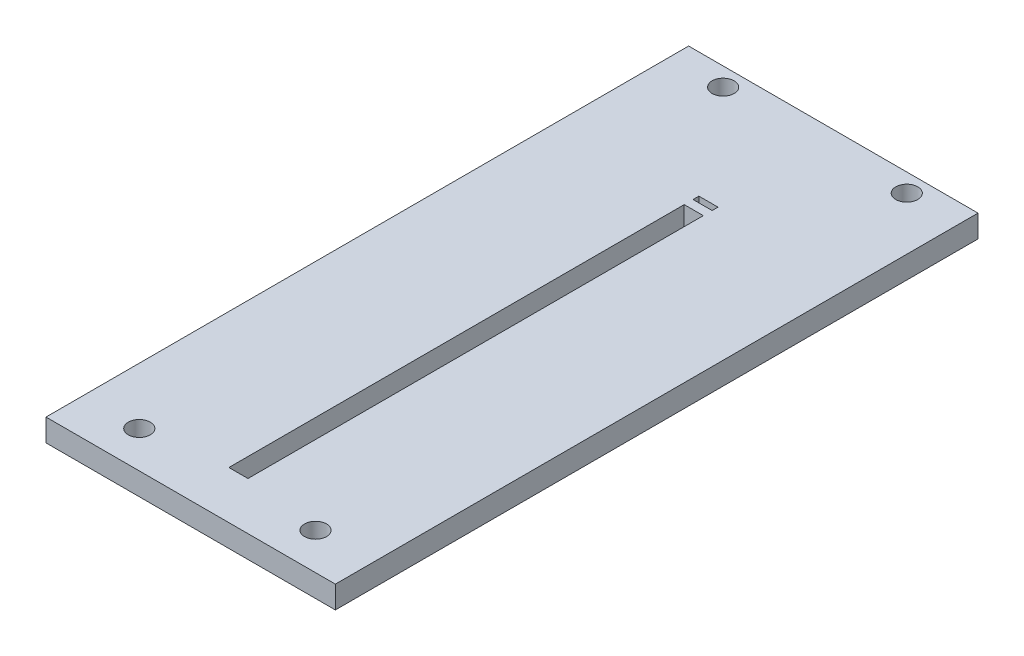
ISO-10303-21;
HEADER;
FILE_DESCRIPTION(('STEP AP214'),'2;1');
FILE_NAME('part.step','',(''),(''),'','','');
FILE_SCHEMA(('AUTOMOTIVE_DESIGN { 1 0 10303 214 1 1 1 1 }'));
ENDSEC;
DATA;
#1=APPLICATION_CONTEXT('core data for automotive mechanical design processes');
#2=APPLICATION_PROTOCOL_DEFINITION('international standard','automotive_design',2000,#1);
#3=PRODUCT_CONTEXT('',#1,'mechanical');
#4=PRODUCT('Part','Part','',(#3));
#5=PRODUCT_RELATED_PRODUCT_CATEGORY('part','',(#4));
#6=PRODUCT_DEFINITION_FORMATION('','',#4);
#7=PRODUCT_DEFINITION_CONTEXT('part definition',#1,'design');
#8=PRODUCT_DEFINITION('design','',#6,#7);
#9=PRODUCT_DEFINITION_SHAPE('','',#8);
#10=(LENGTH_UNIT() NAMED_UNIT(*) SI_UNIT(.MILLI.,.METRE.));
#11=(NAMED_UNIT(*) PLANE_ANGLE_UNIT() SI_UNIT($,.RADIAN.));
#12=(NAMED_UNIT(*) SI_UNIT($,.STERADIAN.) SOLID_ANGLE_UNIT());
#13=UNCERTAINTY_MEASURE_WITH_UNIT(LENGTH_MEASURE(1.E-05),#10,'distance_accuracy_value','');
#14=(GEOMETRIC_REPRESENTATION_CONTEXT(3) GLOBAL_UNCERTAINTY_ASSIGNED_CONTEXT((#13)) GLOBAL_UNIT_ASSIGNED_CONTEXT((#10,
#11,#12)) REPRESENTATION_CONTEXT('',''));
#15=CARTESIAN_POINT('',(0.,0.,0.));
#16=DIRECTION('',(0.,0.,1.));
#17=DIRECTION('',(1.,0.,0.));
#18=AXIS2_PLACEMENT_3D('',#15,#16,#17);
#19=CARTESIAN_POINT('',(0.,3.05,0.));
#20=DIRECTION('',(0.,1.,0.));
#21=DIRECTION('',(0.,0.,1.));
#22=AXIS2_PLACEMENT_3D('',#19,#20,#21);
#23=PLANE('',#22);
#24=CARTESIAN_POINT('',(-12.5,3.05,-85.));
#25=DIRECTION('',(0.,1.,0.));
#26=DIRECTION('',(0.,0.,1.));
#27=AXIS2_PLACEMENT_3D('',#24,#25,#26);
#28=CIRCLE('',#27,1.5);
#29=CARTESIAN_POINT('',(-12.5,3.05,-83.5));
#30=VERTEX_POINT('',#29);
#31=EDGE_CURVE('E530',#30,#30,#28,.T.);
#32=ORIENTED_EDGE('',*,*,#31,.F.);
#33=EDGE_LOOP('',(#32));
#34=FACE_BOUND('',#33,.T.);
#35=CARTESIAN_POINT('',(12.5,3.05,-85.));
#36=DIRECTION('',(0.,1.,0.));
#37=DIRECTION('',(0.,0.,1.));
#38=AXIS2_PLACEMENT_3D('',#35,#36,#37);
#39=CIRCLE('',#38,1.5);
#40=CARTESIAN_POINT('',(12.5,3.05,-83.5));
#41=VERTEX_POINT('',#40);
#42=EDGE_CURVE('E534',#41,#41,#39,.T.);
#43=ORIENTED_EDGE('',*,*,#42,.F.);
#44=EDGE_LOOP('',(#43));
#45=FACE_BOUND('',#44,.T.);
#46=CARTESIAN_POINT('',(12.,3.05,-5.));
#47=DIRECTION('',(0.,-1.,0.));
#48=DIRECTION('',(0.,0.,-1.));
#49=AXIS2_PLACEMENT_3D('',#46,#47,#48);
#50=CIRCLE('',#49,1.5);
#51=CARTESIAN_POINT('',(12.,3.05,-6.5));
#52=VERTEX_POINT('',#51);
#53=EDGE_CURVE('E550',#52,#52,#50,.T.);
#54=ORIENTED_EDGE('',*,*,#53,.T.);
#55=EDGE_LOOP('',(#54));
#56=FACE_BOUND('',#55,.T.);
#57=DIRECTION('',(1.,0.,0.));
#58=VECTOR('',#57,1.);
#59=CARTESIAN_POINT('',(0.,3.05,-6.5));
#60=LINE('',#59,#58);
#61=CARTESIAN_POINT('',(-1.30000000000001,3.05,-6.5));
#62=VERTEX_POINT('',#61);
#63=CARTESIAN_POINT('',(1.30000000000001,3.05,-6.5));
#64=VERTEX_POINT('',#63);
#65=EDGE_CURVE('E85',#62,#64,#60,.T.);
#66=ORIENTED_EDGE('',*,*,#65,.F.);
#67=DIRECTION('',(0.,0.,1.));
#68=VECTOR('',#67,1.);
#69=CARTESIAN_POINT('',(-1.30000000000001,3.05,0.));
#70=LINE('',#69,#68);
#71=CARTESIAN_POINT('',(-1.30000000000001,3.05,-68.5));
#72=VERTEX_POINT('',#71);
#73=EDGE_CURVE('E183',#72,#62,#70,.T.);
#74=ORIENTED_EDGE('',*,*,#73,.F.);
#75=DIRECTION('',(-1.,0.,0.));
#76=VECTOR('',#75,1.);
#77=CARTESIAN_POINT('',(0.,3.05,-68.5));
#78=LINE('',#77,#76);
#79=CARTESIAN_POINT('',(1.30000000000001,3.05,-68.5));
#80=VERTEX_POINT('',#79);
#81=EDGE_CURVE('E187',#80,#72,#78,.T.);
#82=ORIENTED_EDGE('',*,*,#81,.F.);
#83=DIRECTION('',(0.,0.,-1.));
#84=VECTOR('',#83,1.);
#85=CARTESIAN_POINT('',(1.30000000000001,3.05,0.));
#86=LINE('',#85,#84);
#87=EDGE_CURVE('E199',#64,#80,#86,.T.);
#88=ORIENTED_EDGE('',*,*,#87,.F.);
#89=EDGE_LOOP('',(#66,#74,#82,#88));
#90=FACE_BOUND('',#89,.T.);
#91=DIRECTION('',(0.,0.,-1.));
#92=VECTOR('',#91,1.);
#93=CARTESIAN_POINT('',(1.29999999999999,3.05,0.));
#94=LINE('',#93,#92);
#95=CARTESIAN_POINT('',(1.30000000000001,3.05,-69.7));
#96=VERTEX_POINT('',#95);
#97=CARTESIAN_POINT('',(1.30000000000001,3.05,-70.5));
#98=VERTEX_POINT('',#97);
#99=EDGE_CURVE('E236',#96,#98,#94,.T.);
#100=ORIENTED_EDGE('',*,*,#99,.F.);
#101=DIRECTION('',(1.,0.,0.));
#102=VECTOR('',#101,1.);
#103=CARTESIAN_POINT('',(0.,3.05,-69.7));
#104=LINE('',#103,#102);
#105=CARTESIAN_POINT('',(-1.30000000000001,3.05,-69.7));
#106=VERTEX_POINT('',#105);
#107=EDGE_CURVE('E200',#106,#96,#104,.T.);
#108=ORIENTED_EDGE('',*,*,#107,.F.);
#109=DIRECTION('',(0.,0.,1.));
#110=VECTOR('',#109,1.);
#111=CARTESIAN_POINT('',(-1.29999999999999,3.05,0.));
#112=LINE('',#111,#110);
#113=CARTESIAN_POINT('',(-1.30000000000001,3.05,-70.5));
#114=VERTEX_POINT('',#113);
#115=EDGE_CURVE('E93',#114,#106,#112,.T.);
#116=ORIENTED_EDGE('',*,*,#115,.F.);
#117=DIRECTION('',(-1.,0.,0.));
#118=VECTOR('',#117,1.);
#119=CARTESIAN_POINT('',(0.,3.05,-70.5));
#120=LINE('',#119,#118);
#121=EDGE_CURVE('E231',#98,#114,#120,.T.);
#122=ORIENTED_EDGE('',*,*,#121,.F.);
#123=EDGE_LOOP('',(#100,#108,#116,#122));
#124=FACE_BOUND('',#123,.T.);
#125=DIRECTION('',(1.,0.,0.));
#126=VECTOR('',#125,1.);
#127=CARTESIAN_POINT('',(0.,3.05,0.));
#128=LINE('',#127,#126);
#129=CARTESIAN_POINT('',(-19.7,3.05,0.));
#130=VERTEX_POINT('',#129);
#131=CARTESIAN_POINT('',(19.7,3.05,0.));
#132=VERTEX_POINT('',#131);
#133=EDGE_CURVE('E257',#130,#132,#128,.T.);
#134=ORIENTED_EDGE('',*,*,#133,.T.);
#135=DIRECTION('',(0.,0.,-1.));
#136=VECTOR('',#135,1.);
#137=CARTESIAN_POINT('',(19.7,3.05,0.));
#138=LINE('',#137,#136);
#139=CARTESIAN_POINT('',(19.7,3.05,-87.5));
#140=VERTEX_POINT('',#139);
#141=EDGE_CURVE('E261',#132,#140,#138,.T.);
#142=ORIENTED_EDGE('',*,*,#141,.T.);
#143=DIRECTION('',(1.,0.,0.));
#144=VECTOR('',#143,1.);
#145=CARTESIAN_POINT('',(0.,3.05,-87.5));
#146=LINE('',#145,#144);
#147=CARTESIAN_POINT('',(-19.7,3.05,-87.5));
#148=VERTEX_POINT('',#147);
#149=EDGE_CURVE('E265',#148,#140,#146,.T.);
#150=ORIENTED_EDGE('',*,*,#149,.F.);
#151=DIRECTION('',(0.,0.,-1.));
#152=VECTOR('',#151,1.);
#153=CARTESIAN_POINT('',(-19.7,3.05,0.));
#154=LINE('',#153,#152);
#155=EDGE_CURVE('E269',#130,#148,#154,.T.);
#156=ORIENTED_EDGE('',*,*,#155,.F.);
#157=EDGE_LOOP('',(#134,#142,#150,#156));
#158=FACE_BOUND('',#157,.T.);
#159=CARTESIAN_POINT('',(-12.,3.05,-5.));
#160=DIRECTION('',(0.,1.,0.));
#161=DIRECTION('',(0.,0.,1.));
#162=AXIS2_PLACEMENT_3D('',#159,#160,#161);
#163=CIRCLE('',#162,1.5);
#164=CARTESIAN_POINT('',(-12.,3.05,-3.5));
#165=VERTEX_POINT('',#164);
#166=EDGE_CURVE('E547',#165,#165,#163,.T.);
#167=ORIENTED_EDGE('',*,*,#166,.F.);
#168=EDGE_LOOP('',(#167));
#169=FACE_BOUND('',#168,.T.);
#170=ADVANCED_FACE('F69',(#34,#45,#56,#90,#124,#158,#169),#23,.T.);
#171=CARTESIAN_POINT('',(0.,0.,0.));
#172=DIRECTION('',(0.,1.,0.));
#173=DIRECTION('',(0.,0.,1.));
#174=AXIS2_PLACEMENT_3D('',#171,#172,#173);
#175=PLANE('',#174);
#176=CARTESIAN_POINT('',(-12.5,0.,-85.));
#177=DIRECTION('',(0.,1.,0.));
#178=DIRECTION('',(0.,0.,1.));
#179=AXIS2_PLACEMENT_3D('',#176,#177,#178);
#180=CIRCLE('',#179,1.5);
#181=CARTESIAN_POINT('',(-12.5,0.,-83.5));
#182=VERTEX_POINT('',#181);
#183=EDGE_CURVE('E528',#182,#182,#180,.T.);
#184=ORIENTED_EDGE('',*,*,#183,.T.);
#185=EDGE_LOOP('',(#184));
#186=FACE_BOUND('',#185,.T.);
#187=CARTESIAN_POINT('',(12.5,0.,-85.));
#188=DIRECTION('',(0.,1.,0.));
#189=DIRECTION('',(0.,0.,1.));
#190=AXIS2_PLACEMENT_3D('',#187,#188,#189);
#191=CIRCLE('',#190,1.5);
#192=CARTESIAN_POINT('',(12.5,0.,-83.5));
#193=VERTEX_POINT('',#192);
#194=EDGE_CURVE('E540',#193,#193,#191,.T.);
#195=ORIENTED_EDGE('',*,*,#194,.T.);
#196=EDGE_LOOP('',(#195));
#197=FACE_BOUND('',#196,.T.);
#198=DIRECTION('',(1.,0.,0.));
#199=VECTOR('',#198,1.);
#200=CARTESIAN_POINT('',(0.,0.,0.));
#201=LINE('',#200,#199);
#202=CARTESIAN_POINT('',(-19.7,0.,0.));
#203=VERTEX_POINT('',#202);
#204=CARTESIAN_POINT('',(19.7,0.,0.));
#205=VERTEX_POINT('',#204);
#206=EDGE_CURVE('E209',#203,#205,#201,.T.);
#207=ORIENTED_EDGE('',*,*,#206,.F.);
#208=DIRECTION('',(0.,0.,-1.));
#209=VECTOR('',#208,1.);
#210=CARTESIAN_POINT('',(-19.7,0.,0.));
#211=LINE('',#210,#209);
#212=CARTESIAN_POINT('',(-19.7,0.,-87.5));
#213=VERTEX_POINT('',#212);
#214=EDGE_CURVE('E262',#203,#213,#211,.T.);
#215=ORIENTED_EDGE('',*,*,#214,.T.);
#216=DIRECTION('',(1.,0.,0.));
#217=VECTOR('',#216,1.);
#218=CARTESIAN_POINT('',(0.,0.,-87.5));
#219=LINE('',#218,#217);
#220=CARTESIAN_POINT('',(19.7,0.,-87.5));
#221=VERTEX_POINT('',#220);
#222=EDGE_CURVE('E281',#213,#221,#219,.T.);
#223=ORIENTED_EDGE('',*,*,#222,.T.);
#224=DIRECTION('',(0.,0.,-1.));
#225=VECTOR('',#224,1.);
#226=CARTESIAN_POINT('',(19.7,0.,0.));
#227=LINE('',#226,#225);
#228=EDGE_CURVE('E277',#205,#221,#227,.T.);
#229=ORIENTED_EDGE('',*,*,#228,.F.);
#230=EDGE_LOOP('',(#207,#215,#223,#229));
#231=FACE_BOUND('',#230,.T.);
#232=DIRECTION('',(1.,0.,0.));
#233=VECTOR('',#232,1.);
#234=CARTESIAN_POINT('',(0.,0.,-69.7));
#235=LINE('',#234,#233);
#236=CARTESIAN_POINT('',(-1.30000000000001,0.,-69.7));
#237=VERTEX_POINT('',#236);
#238=CARTESIAN_POINT('',(1.30000000000001,0.,-69.7));
#239=VERTEX_POINT('',#238);
#240=EDGE_CURVE('E232',#237,#239,#235,.T.);
#241=ORIENTED_EDGE('',*,*,#240,.T.);
#242=DIRECTION('',(0.,0.,-1.));
#243=VECTOR('',#242,1.);
#244=CARTESIAN_POINT('',(1.29999999999999,0.,0.));
#245=LINE('',#244,#243);
#246=CARTESIAN_POINT('',(1.30000000000001,0.,-70.5));
#247=VERTEX_POINT('',#246);
#248=EDGE_CURVE('E250',#239,#247,#245,.T.);
#249=ORIENTED_EDGE('',*,*,#248,.T.);
#250=DIRECTION('',(-1.,0.,0.));
#251=VECTOR('',#250,1.);
#252=CARTESIAN_POINT('',(0.,0.,-70.5));
#253=LINE('',#252,#251);
#254=CARTESIAN_POINT('',(-1.30000000000001,0.,-70.5));
#255=VERTEX_POINT('',#254);
#256=EDGE_CURVE('E246',#247,#255,#253,.T.);
#257=ORIENTED_EDGE('',*,*,#256,.T.);
#258=DIRECTION('',(0.,0.,1.));
#259=VECTOR('',#258,1.);
#260=CARTESIAN_POINT('',(-1.29999999999999,0.,0.));
#261=LINE('',#260,#259);
#262=EDGE_CURVE('E218',#255,#237,#261,.T.);
#263=ORIENTED_EDGE('',*,*,#262,.T.);
#264=EDGE_LOOP('',(#241,#249,#257,#263));
#265=FACE_BOUND('',#264,.T.);
#266=DIRECTION('',(0.,0.,1.));
#267=VECTOR('',#266,1.);
#268=CARTESIAN_POINT('',(-1.30000000000001,0.,0.));
#269=LINE('',#268,#267);
#270=CARTESIAN_POINT('',(-1.30000000000001,0.,-68.5));
#271=VERTEX_POINT('',#270);
#272=CARTESIAN_POINT('',(-1.30000000000001,0.,-6.5));
#273=VERTEX_POINT('',#272);
#274=EDGE_CURVE('E168',#271,#273,#269,.T.);
#275=ORIENTED_EDGE('',*,*,#274,.T.);
#276=DIRECTION('',(1.,0.,0.));
#277=VECTOR('',#276,1.);
#278=CARTESIAN_POINT('',(0.,0.,-6.5));
#279=LINE('',#278,#277);
#280=CARTESIAN_POINT('',(1.30000000000001,0.,-6.5));
#281=VERTEX_POINT('',#280);
#282=EDGE_CURVE('E161',#273,#281,#279,.T.);
#283=ORIENTED_EDGE('',*,*,#282,.T.);
#284=DIRECTION('',(0.,0.,-1.));
#285=VECTOR('',#284,1.);
#286=CARTESIAN_POINT('',(1.30000000000001,0.,0.));
#287=LINE('',#286,#285);
#288=CARTESIAN_POINT('',(1.30000000000001,0.,-68.5));
#289=VERTEX_POINT('',#288);
#290=EDGE_CURVE('E172',#281,#289,#287,.T.);
#291=ORIENTED_EDGE('',*,*,#290,.T.);
#292=DIRECTION('',(-1.,0.,0.));
#293=VECTOR('',#292,1.);
#294=CARTESIAN_POINT('',(0.,0.,-68.5));
#295=LINE('',#294,#293);
#296=EDGE_CURVE('E177',#289,#271,#295,.T.);
#297=ORIENTED_EDGE('',*,*,#296,.T.);
#298=EDGE_LOOP('',(#275,#283,#291,#297));
#299=FACE_BOUND('',#298,.T.);
#300=CARTESIAN_POINT('',(12.,0.,-5.));
#301=DIRECTION('',(0.,-1.,0.));
#302=DIRECTION('',(0.,0.,-1.));
#303=AXIS2_PLACEMENT_3D('',#300,#301,#302);
#304=CIRCLE('',#303,1.5);
#305=CARTESIAN_POINT('',(12.,0.,-6.5));
#306=VERTEX_POINT('',#305);
#307=EDGE_CURVE('E190',#306,#306,#304,.T.);
#308=ORIENTED_EDGE('',*,*,#307,.F.);
#309=EDGE_LOOP('',(#308));
#310=FACE_BOUND('',#309,.T.);
#311=CARTESIAN_POINT('',(-12.,0.,-5.));
#312=DIRECTION('',(0.,1.,0.));
#313=DIRECTION('',(0.,0.,1.));
#314=AXIS2_PLACEMENT_3D('',#311,#312,#313);
#315=CIRCLE('',#314,1.5);
#316=CARTESIAN_POINT('',(-12.,0.,-3.5));
#317=VERTEX_POINT('',#316);
#318=EDGE_CURVE('E228',#317,#317,#315,.T.);
#319=ORIENTED_EDGE('',*,*,#318,.T.);
#320=EDGE_LOOP('',(#319));
#321=FACE_BOUND('',#320,.T.);
#322=ADVANCED_FACE('F179',(#186,#197,#231,#265,#299,#310,#321),#175,.F.);
#323=CARTESIAN_POINT('',(0.,3.05,0.));
#324=DIRECTION('',(0.,0.,-1.));
#325=DIRECTION('',(-1.,0.,0.));
#326=AXIS2_PLACEMENT_3D('',#323,#324,#325);
#327=PLANE('',#326);
#328=ORIENTED_EDGE('',*,*,#206,.T.);
#329=DIRECTION('',(0.,-1.,0.));
#330=VECTOR('',#329,1.);
#331=CARTESIAN_POINT('',(19.7,3.05,0.));
#332=LINE('',#331,#330);
#333=EDGE_CURVE('E12',#132,#205,#332,.T.);
#334=ORIENTED_EDGE('',*,*,#333,.F.);
#335=ORIENTED_EDGE('',*,*,#133,.F.);
#336=DIRECTION('',(0.,-1.,0.));
#337=VECTOR('',#336,1.);
#338=CARTESIAN_POINT('',(-19.7,3.05,0.));
#339=LINE('',#338,#337);
#340=EDGE_CURVE('E273',#130,#203,#339,.T.);
#341=ORIENTED_EDGE('',*,*,#340,.T.);
#342=EDGE_LOOP('',(#328,#334,#335,#341));
#343=FACE_BOUND('',#342,.T.);
#344=ADVANCED_FACE('F71',(#343),#327,.F.);
#345=CARTESIAN_POINT('',(19.7,3.05,0.));
#346=DIRECTION('',(-1.,0.,0.));
#347=DIRECTION('',(0.,0.,1.));
#348=AXIS2_PLACEMENT_3D('',#345,#346,#347);
#349=PLANE('',#348);
#350=ORIENTED_EDGE('',*,*,#228,.T.);
#351=DIRECTION('',(0.,-1.,0.));
#352=VECTOR('',#351,1.);
#353=CARTESIAN_POINT('',(19.7,3.05,-87.5));
#354=LINE('',#353,#352);
#355=EDGE_CURVE('E78',#140,#221,#354,.T.);
#356=ORIENTED_EDGE('',*,*,#355,.F.);
#357=ORIENTED_EDGE('',*,*,#141,.F.);
#358=ORIENTED_EDGE('',*,*,#333,.T.);
#359=EDGE_LOOP('',(#350,#356,#357,#358));
#360=FACE_BOUND('',#359,.T.);
#361=ADVANCED_FACE('F299',(#360),#349,.F.);
#362=CARTESIAN_POINT('',(0.,3.05,-87.5));
#363=DIRECTION('',(0.,0.,-1.));
#364=DIRECTION('',(-1.,0.,0.));
#365=AXIS2_PLACEMENT_3D('',#362,#363,#364);
#366=PLANE('',#365);
#367=ORIENTED_EDGE('',*,*,#222,.F.);
#368=DIRECTION('',(0.,-1.,0.));
#369=VECTOR('',#368,1.);
#370=CARTESIAN_POINT('',(-19.7,3.05,-87.5));
#371=LINE('',#370,#369);
#372=EDGE_CURVE('E290',#148,#213,#371,.T.);
#373=ORIENTED_EDGE('',*,*,#372,.F.);
#374=ORIENTED_EDGE('',*,*,#149,.T.);
#375=ORIENTED_EDGE('',*,*,#355,.T.);
#376=EDGE_LOOP('',(#367,#373,#374,#375));
#377=FACE_BOUND('',#376,.T.);
#378=ADVANCED_FACE('F296',(#377),#366,.T.);
#379=CARTESIAN_POINT('',(-19.7,3.05,0.));
#380=DIRECTION('',(-1.,0.,0.));
#381=DIRECTION('',(0.,0.,1.));
#382=AXIS2_PLACEMENT_3D('',#379,#380,#381);
#383=PLANE('',#382);
#384=ORIENTED_EDGE('',*,*,#214,.F.);
#385=ORIENTED_EDGE('',*,*,#340,.F.);
#386=ORIENTED_EDGE('',*,*,#155,.T.);
#387=ORIENTED_EDGE('',*,*,#372,.T.);
#388=EDGE_LOOP('',(#384,#385,#386,#387));
#389=FACE_BOUND('',#388,.T.);
#390=ADVANCED_FACE('F306',(#389),#383,.T.);
#391=CARTESIAN_POINT('',(1.29999999999999,0.,0.));
#392=DIRECTION('',(1.,0.,0.));
#393=DIRECTION('',(0.,0.,-1.));
#394=AXIS2_PLACEMENT_3D('',#391,#392,#393);
#395=PLANE('',#394);
#396=ORIENTED_EDGE('',*,*,#99,.T.);
#397=DIRECTION('',(0.,1.,0.));
#398=VECTOR('',#397,1.);
#399=CARTESIAN_POINT('',(1.30000000000001,0.,-70.5));
#400=LINE('',#399,#398);
#401=EDGE_CURVE('E219',#247,#98,#400,.T.);
#402=ORIENTED_EDGE('',*,*,#401,.F.);
#403=ORIENTED_EDGE('',*,*,#248,.F.);
#404=DIRECTION('',(0.,1.,0.));
#405=VECTOR('',#404,1.);
#406=CARTESIAN_POINT('',(1.30000000000001,0.,-69.7));
#407=LINE('',#406,#405);
#408=EDGE_CURVE('E215',#239,#96,#407,.T.);
#409=ORIENTED_EDGE('',*,*,#408,.T.);
#410=EDGE_LOOP('',(#396,#402,#403,#409));
#411=FACE_BOUND('',#410,.T.);
#412=ADVANCED_FACE('F332',(#411),#395,.F.);
#413=CARTESIAN_POINT('',(0.,0.,-70.5));
#414=DIRECTION('',(0.,0.,-1.));
#415=DIRECTION('',(-1.,0.,0.));
#416=AXIS2_PLACEMENT_3D('',#413,#414,#415);
#417=PLANE('',#416);
#418=ORIENTED_EDGE('',*,*,#121,.T.);
#419=DIRECTION('',(0.,1.,0.));
#420=VECTOR('',#419,1.);
#421=CARTESIAN_POINT('',(-1.30000000000001,0.,-70.5));
#422=LINE('',#421,#420);
#423=EDGE_CURVE('E222',#255,#114,#422,.T.);
#424=ORIENTED_EDGE('',*,*,#423,.F.);
#425=ORIENTED_EDGE('',*,*,#256,.F.);
#426=ORIENTED_EDGE('',*,*,#401,.T.);
#427=EDGE_LOOP('',(#418,#424,#425,#426));
#428=FACE_BOUND('',#427,.T.);
#429=ADVANCED_FACE('F348',(#428),#417,.F.);
#430=CARTESIAN_POINT('',(-1.29999999999999,0.,0.));
#431=DIRECTION('',(-1.,0.,0.));
#432=DIRECTION('',(0.,0.,1.));
#433=AXIS2_PLACEMENT_3D('',#430,#431,#432);
#434=PLANE('',#433);
#435=ORIENTED_EDGE('',*,*,#115,.T.);
#436=DIRECTION('',(0.,1.,0.));
#437=VECTOR('',#436,1.);
#438=CARTESIAN_POINT('',(-1.30000000000001,0.,-69.7));
#439=LINE('',#438,#437);
#440=EDGE_CURVE('E225',#237,#106,#439,.T.);
#441=ORIENTED_EDGE('',*,*,#440,.F.);
#442=ORIENTED_EDGE('',*,*,#262,.F.);
#443=ORIENTED_EDGE('',*,*,#423,.T.);
#444=EDGE_LOOP('',(#435,#441,#442,#443));
#445=FACE_BOUND('',#444,.T.);
#446=ADVANCED_FACE('F327',(#445),#434,.F.);
#447=CARTESIAN_POINT('',(0.,0.,-69.7));
#448=DIRECTION('',(0.,0.,1.));
#449=DIRECTION('',(1.,0.,0.));
#450=AXIS2_PLACEMENT_3D('',#447,#448,#449);
#451=PLANE('',#450);
#452=ORIENTED_EDGE('',*,*,#107,.T.);
#453=ORIENTED_EDGE('',*,*,#408,.F.);
#454=ORIENTED_EDGE('',*,*,#240,.F.);
#455=ORIENTED_EDGE('',*,*,#440,.T.);
#456=EDGE_LOOP('',(#452,#453,#454,#455));
#457=FACE_BOUND('',#456,.T.);
#458=ADVANCED_FACE('F362',(#457),#451,.F.);
#459=CARTESIAN_POINT('',(0.,0.,-6.5));
#460=DIRECTION('',(0.,0.,1.));
#461=DIRECTION('',(1.,0.,0.));
#462=AXIS2_PLACEMENT_3D('',#459,#460,#461);
#463=PLANE('',#462);
#464=ORIENTED_EDGE('',*,*,#65,.T.);
#465=DIRECTION('',(0.,1.,0.));
#466=VECTOR('',#465,1.);
#467=CARTESIAN_POINT('',(1.30000000000001,0.,-6.5));
#468=LINE('',#467,#466);
#469=EDGE_CURVE('E157',#281,#64,#468,.T.);
#470=ORIENTED_EDGE('',*,*,#469,.F.);
#471=ORIENTED_EDGE('',*,*,#282,.F.);
#472=DIRECTION('',(0.,1.,0.));
#473=VECTOR('',#472,1.);
#474=CARTESIAN_POINT('',(-1.30000000000001,0.,-6.5));
#475=LINE('',#474,#473);
#476=EDGE_CURVE('E206',#273,#62,#475,.T.);
#477=ORIENTED_EDGE('',*,*,#476,.T.);
#478=EDGE_LOOP('',(#464,#470,#471,#477));
#479=FACE_BOUND('',#478,.T.);
#480=ADVANCED_FACE('F159',(#479),#463,.F.);
#481=CARTESIAN_POINT('',(-1.30000000000001,0.,0.));
#482=DIRECTION('',(-1.,0.,0.));
#483=DIRECTION('',(0.,0.,1.));
#484=AXIS2_PLACEMENT_3D('',#481,#482,#483);
#485=PLANE('',#484);
#486=ORIENTED_EDGE('',*,*,#73,.T.);
#487=ORIENTED_EDGE('',*,*,#476,.F.);
#488=ORIENTED_EDGE('',*,*,#274,.F.);
#489=DIRECTION('',(0.,1.,0.));
#490=VECTOR('',#489,1.);
#491=CARTESIAN_POINT('',(-1.30000000000001,0.,-68.5));
#492=LINE('',#491,#490);
#493=EDGE_CURVE('E210',#271,#72,#492,.T.);
#494=ORIENTED_EDGE('',*,*,#493,.T.);
#495=EDGE_LOOP('',(#486,#487,#488,#494));
#496=FACE_BOUND('',#495,.T.);
#497=ADVANCED_FACE('F375',(#496),#485,.F.);
#498=CARTESIAN_POINT('',(0.,0.,-68.5));
#499=DIRECTION('',(0.,0.,-1.));
#500=DIRECTION('',(-1.,0.,0.));
#501=AXIS2_PLACEMENT_3D('',#498,#499,#500);
#502=PLANE('',#501);
#503=ORIENTED_EDGE('',*,*,#81,.T.);
#504=ORIENTED_EDGE('',*,*,#493,.F.);
#505=ORIENTED_EDGE('',*,*,#296,.F.);
#506=DIRECTION('',(0.,1.,0.));
#507=VECTOR('',#506,1.);
#508=CARTESIAN_POINT('',(1.30000000000001,0.,-68.5));
#509=LINE('',#508,#507);
#510=EDGE_CURVE('E167',#289,#80,#509,.T.);
#511=ORIENTED_EDGE('',*,*,#510,.T.);
#512=EDGE_LOOP('',(#503,#504,#505,#511));
#513=FACE_BOUND('',#512,.T.);
#514=ADVANCED_FACE('F382',(#513),#502,.F.);
#515=CARTESIAN_POINT('',(1.30000000000001,0.,0.));
#516=DIRECTION('',(1.,0.,0.));
#517=DIRECTION('',(0.,0.,-1.));
#518=AXIS2_PLACEMENT_3D('',#515,#516,#517);
#519=PLANE('',#518);
#520=ORIENTED_EDGE('',*,*,#87,.T.);
#521=ORIENTED_EDGE('',*,*,#510,.F.);
#522=ORIENTED_EDGE('',*,*,#290,.F.);
#523=ORIENTED_EDGE('',*,*,#469,.T.);
#524=EDGE_LOOP('',(#520,#521,#522,#523));
#525=FACE_BOUND('',#524,.T.);
#526=ADVANCED_FACE('F173',(#525),#519,.F.);
#527=CARTESIAN_POINT('',(12.,0.,-5.));
#528=DIRECTION('',(0.,1.,0.));
#529=DIRECTION('',(0.,0.,1.));
#530=AXIS2_PLACEMENT_3D('',#527,#528,#529);
#531=CYLINDRICAL_SURFACE('',#530,1.5);
#532=ORIENTED_EDGE('',*,*,#307,.T.);
#533=EDGE_LOOP('',(#532));
#534=FACE_BOUND('',#533,.T.);
#535=ORIENTED_EDGE('',*,*,#53,.F.);
#536=EDGE_LOOP('',(#535));
#537=FACE_BOUND('',#536,.T.);
#538=ADVANCED_FACE('F397',(#534,#537),#531,.F.);
#539=CARTESIAN_POINT('',(-12.,0.,-5.));
#540=DIRECTION('',(0.,1.,0.));
#541=DIRECTION('',(0.,0.,1.));
#542=AXIS2_PLACEMENT_3D('',#539,#540,#541);
#543=CYLINDRICAL_SURFACE('',#542,1.5);
#544=ORIENTED_EDGE('',*,*,#318,.F.);
#545=EDGE_LOOP('',(#544));
#546=FACE_BOUND('',#545,.T.);
#547=ORIENTED_EDGE('',*,*,#166,.T.);
#548=EDGE_LOOP('',(#547));
#549=FACE_BOUND('',#548,.T.);
#550=ADVANCED_FACE('F404',(#546,#549),#543,.F.);
#551=CARTESIAN_POINT('',(12.5,3.05,-85.));
#552=DIRECTION('',(0.,1.,0.));
#553=DIRECTION('',(0.,0.,1.));
#554=AXIS2_PLACEMENT_3D('',#551,#552,#553);
#555=CYLINDRICAL_SURFACE('',#554,1.5);
#556=ORIENTED_EDGE('',*,*,#194,.F.);
#557=EDGE_LOOP('',(#556));
#558=FACE_BOUND('',#557,.T.);
#559=ORIENTED_EDGE('',*,*,#42,.T.);
#560=EDGE_LOOP('',(#559));
#561=FACE_BOUND('',#560,.T.);
#562=ADVANCED_FACE('F412',(#558,#561),#555,.F.);
#563=CARTESIAN_POINT('',(-12.5,3.05,-85.));
#564=DIRECTION('',(0.,1.,0.));
#565=DIRECTION('',(0.,0.,1.));
#566=AXIS2_PLACEMENT_3D('',#563,#564,#565);
#567=CYLINDRICAL_SURFACE('',#566,1.5);
#568=ORIENTED_EDGE('',*,*,#183,.F.);
#569=EDGE_LOOP('',(#568));
#570=FACE_BOUND('',#569,.T.);
#571=ORIENTED_EDGE('',*,*,#31,.T.);
#572=EDGE_LOOP('',(#571));
#573=FACE_BOUND('',#572,.T.);
#574=ADVANCED_FACE('F420',(#570,#573),#567,.F.);
#575=CLOSED_SHELL('',(#170,#322,#344,#361,#378,#390,#412,#429,#446,#458,#480,#497,#514,#526,
#538,#550,#562,#574));
#576=MANIFOLD_SOLID_BREP('B2',#575);
#577=ADVANCED_BREP_SHAPE_REPRESENTATION('',(#18,#576),#14);
#578=SHAPE_DEFINITION_REPRESENTATION(#9,#577);
ENDSEC;
END-ISO-10303-21;
